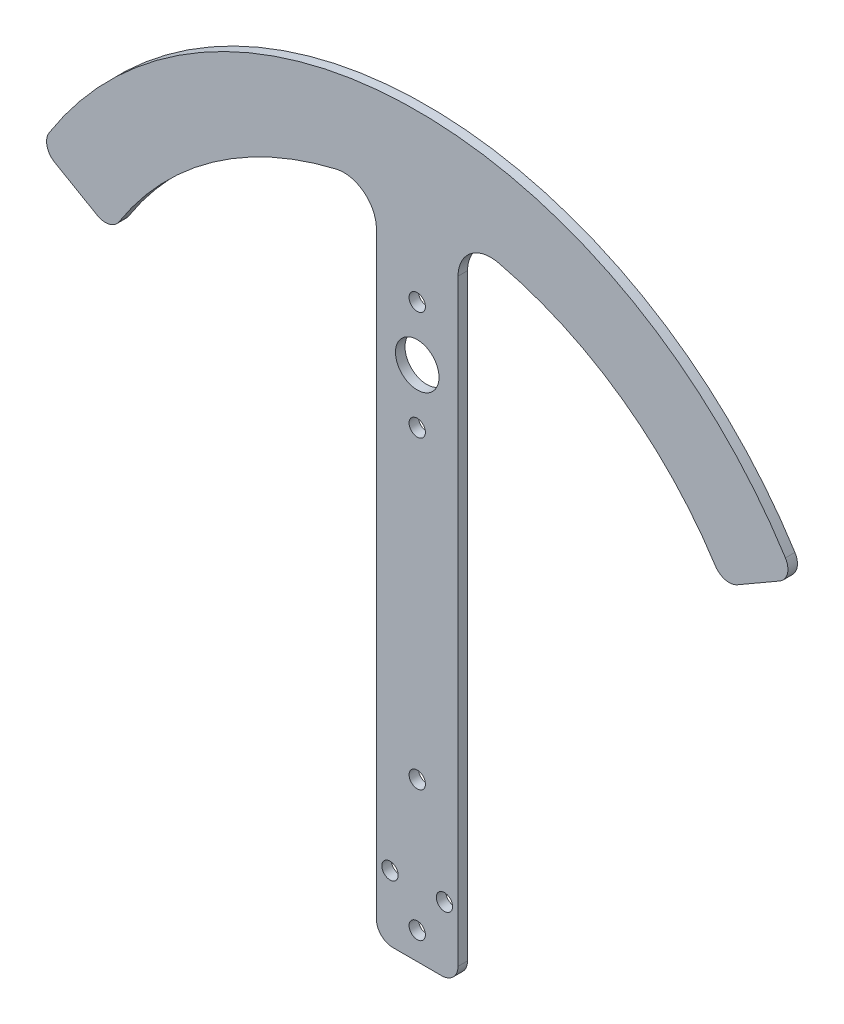
ISO-10303-21;
HEADER;
FILE_DESCRIPTION(('STEP AP214'),'2;1');
FILE_NAME('part.step','',(''),(''),'','','');
FILE_SCHEMA(('AUTOMOTIVE_DESIGN { 1 0 10303 214 1 1 1 1 }'));
ENDSEC;
DATA;
#1=APPLICATION_CONTEXT('core data for automotive mechanical design processes');
#2=APPLICATION_PROTOCOL_DEFINITION('international standard','automotive_design',2000,#1);
#3=PRODUCT_CONTEXT('',#1,'mechanical');
#4=PRODUCT('Part','Part','',(#3));
#5=PRODUCT_RELATED_PRODUCT_CATEGORY('part','',(#4));
#6=PRODUCT_DEFINITION_FORMATION('','',#4);
#7=PRODUCT_DEFINITION_CONTEXT('part definition',#1,'design');
#8=PRODUCT_DEFINITION('design','',#6,#7);
#9=PRODUCT_DEFINITION_SHAPE('','',#8);
#10=(LENGTH_UNIT() NAMED_UNIT(*) SI_UNIT(.MILLI.,.METRE.));
#11=(NAMED_UNIT(*) PLANE_ANGLE_UNIT() SI_UNIT($,.RADIAN.));
#12=(NAMED_UNIT(*) SI_UNIT($,.STERADIAN.) SOLID_ANGLE_UNIT());
#13=UNCERTAINTY_MEASURE_WITH_UNIT(LENGTH_MEASURE(1.E-05),#10,'distance_accuracy_value','');
#14=(GEOMETRIC_REPRESENTATION_CONTEXT(3) GLOBAL_UNCERTAINTY_ASSIGNED_CONTEXT((#13)) GLOBAL_UNIT_ASSIGNED_CONTEXT((#10,
#11,#12)) REPRESENTATION_CONTEXT('',''));
#15=CARTESIAN_POINT('',(0.,0.,0.));
#16=DIRECTION('',(0.,0.,1.));
#17=DIRECTION('',(1.,0.,0.));
#18=AXIS2_PLACEMENT_3D('',#15,#16,#17);
#19=CARTESIAN_POINT('',(0.,0.,1.75));
#20=DIRECTION('',(0.,0.,-1.));
#21=DIRECTION('',(-1.,0.,0.));
#22=AXIS2_PLACEMENT_3D('',#19,#20,#21);
#23=CYLINDRICAL_SURFACE('',#22,65.);
#24=CARTESIAN_POINT('',(0.,0.,1.75));
#25=DIRECTION('',(0.,0.,1.));
#26=DIRECTION('',(1.,0.,0.));
#27=AXIS2_PLACEMENT_3D('',#24,#25,#26);
#28=CIRCLE('',#27,65.);
#29=CARTESIAN_POINT('',(54.8030189340439,34.9518113366794,1.75));
#30=VERTEX_POINT('',#29);
#31=CARTESIAN_POINT('',(14.8728813559322,63.2755671659477,1.75));
#32=VERTEX_POINT('',#31);
#33=EDGE_CURVE('E258',#30,#32,#28,.T.);
#34=ORIENTED_EDGE('',*,*,#33,.T.);
#35=DIRECTION('',(0.,0.,-1.));
#36=VECTOR('',#35,1.);
#37=CARTESIAN_POINT('',(14.8728813559322,63.2755671659478,1.75));
#38=LINE('',#37,#36);
#39=CARTESIAN_POINT('',(14.8728813559322,63.2755671659477,0.));
#40=VERTEX_POINT('',#39);
#41=EDGE_CURVE('E240',#32,#40,#38,.T.);
#42=ORIENTED_EDGE('',*,*,#41,.T.);
#43=CARTESIAN_POINT('',(0.,0.,0.));
#44=DIRECTION('',(0.,0.,1.));
#45=DIRECTION('',(1.,0.,0.));
#46=AXIS2_PLACEMENT_3D('',#43,#44,#45);
#47=CIRCLE('',#46,65.);
#48=CARTESIAN_POINT('',(54.8030189340439,34.9518113366794,0.));
#49=VERTEX_POINT('',#48);
#50=EDGE_CURVE('E307',#49,#40,#47,.T.);
#51=ORIENTED_EDGE('',*,*,#50,.F.);
#52=DIRECTION('',(0.,0.,-1.));
#53=VECTOR('',#52,1.);
#54=CARTESIAN_POINT('',(54.8030189340439,34.9518113366794,1.75));
#55=LINE('',#54,#53);
#56=EDGE_CURVE('E230',#49,#30,#55,.F.);
#57=ORIENTED_EDGE('',*,*,#56,.T.);
#58=EDGE_LOOP('',(#34,#42,#51,#57));
#59=FACE_BOUND('',#58,.T.);
#60=ADVANCED_FACE('F44',(#59),#23,.F.);
#61=CARTESIAN_POINT('',(0.,0.,1.75));
#62=DIRECTION('',(-0.499999999999998,0.86602540378444,0.));
#63=DIRECTION('',(-0.86602540378444,-0.499999999999998,0.));
#64=AXIS2_PLACEMENT_3D('',#61,#62,#63);
#65=PLANE('',#64);
#66=DIRECTION('',(0.86602540378444,0.499999999999998,0.));
#67=VECTOR('',#66,1.);
#68=CARTESIAN_POINT('',(0.,0.,0.));
#69=LINE('',#68,#67);
#70=CARTESIAN_POINT('',(58.832389038692,33.9668956485574,0.));
#71=VERTEX_POINT('',#70);
#72=CARTESIAN_POINT('',(66.6333249958308,38.4707681233425,0.));
#73=VERTEX_POINT('',#72);
#74=EDGE_CURVE('E339',#71,#73,#69,.T.);
#75=ORIENTED_EDGE('',*,*,#74,.T.);
#76=DIRECTION('',(0.,0.,-1.));
#77=VECTOR('',#76,1.);
#78=CARTESIAN_POINT('',(66.6333249958308,38.4707681233425,1.75));
#79=LINE('',#78,#77);
#80=CARTESIAN_POINT('',(66.6333249958308,38.4707681233425,1.75));
#81=VERTEX_POINT('',#80);
#82=EDGE_CURVE('E228',#73,#81,#79,.F.);
#83=ORIENTED_EDGE('',*,*,#82,.T.);
#84=DIRECTION('',(0.86602540378444,0.499999999999998,0.));
#85=VECTOR('',#84,1.);
#86=CARTESIAN_POINT('',(0.,0.,1.75));
#87=LINE('',#86,#85);
#88=CARTESIAN_POINT('',(58.832389038692,33.9668956485574,1.75));
#89=VERTEX_POINT('',#88);
#90=EDGE_CURVE('E265',#89,#81,#87,.T.);
#91=ORIENTED_EDGE('',*,*,#90,.F.);
#92=DIRECTION('',(0.,0.,1.));
#93=VECTOR('',#92,1.);
#94=CARTESIAN_POINT('',(58.832389038692,33.9668956485574,0.));
#95=LINE('',#94,#93);
#96=EDGE_CURVE('E225',#89,#71,#95,.F.);
#97=ORIENTED_EDGE('',*,*,#96,.T.);
#98=EDGE_LOOP('',(#75,#83,#91,#97));
#99=FACE_BOUND('',#98,.T.);
#100=ADVANCED_FACE('F280',(#99),#65,.F.);
#101=CARTESIAN_POINT('',(0.,0.,1.75));
#102=DIRECTION('',(0.,0.,-1.));
#103=DIRECTION('',(-1.,0.,0.));
#104=AXIS2_PLACEMENT_3D('',#101,#102,#103);
#105=CYLINDRICAL_SURFACE('',#104,80.);
#106=CARTESIAN_POINT('',(0.,0.,1.75));
#107=DIRECTION('',(0.,0.,1.));
#108=DIRECTION('',(1.,0.,0.));
#109=AXIS2_PLACEMENT_3D('',#106,#107,#108);
#110=CIRCLE('',#109,80.);
#111=CARTESIAN_POINT('',(67.6709870086554,42.6689291789048,1.75));
#112=VERTEX_POINT('',#111);
#113=CARTESIAN_POINT('',(-67.6709870086554,42.6689291789048,1.75));
#114=VERTEX_POINT('',#113);
#115=EDGE_CURVE('E441',#112,#114,#110,.T.);
#116=ORIENTED_EDGE('',*,*,#115,.F.);
#117=DIRECTION('',(0.,0.,-1.));
#118=VECTOR('',#117,1.);
#119=CARTESIAN_POINT('',(67.6709870086554,42.6689291789048,1.75));
#120=LINE('',#119,#118);
#121=CARTESIAN_POINT('',(67.6709870086554,42.6689291789048,0.));
#122=VERTEX_POINT('',#121);
#123=EDGE_CURVE('E222',#112,#122,#120,.T.);
#124=ORIENTED_EDGE('',*,*,#123,.T.);
#125=CARTESIAN_POINT('',(0.,0.,0.));
#126=DIRECTION('',(0.,0.,1.));
#127=DIRECTION('',(1.,0.,0.));
#128=AXIS2_PLACEMENT_3D('',#125,#126,#127);
#129=CIRCLE('',#128,80.);
#130=CARTESIAN_POINT('',(-67.6709870086554,42.6689291789048,0.));
#131=VERTEX_POINT('',#130);
#132=EDGE_CURVE('E342',#122,#131,#129,.T.);
#133=ORIENTED_EDGE('',*,*,#132,.T.);
#134=DIRECTION('',(0.,0.,-1.));
#135=VECTOR('',#134,1.);
#136=CARTESIAN_POINT('',(-67.6709870086554,42.6689291789048,1.75));
#137=LINE('',#136,#135);
#138=EDGE_CURVE('E220',#131,#114,#137,.F.);
#139=ORIENTED_EDGE('',*,*,#138,.T.);
#140=EDGE_LOOP('',(#116,#124,#133,#139));
#141=FACE_BOUND('',#140,.T.);
#142=ADVANCED_FACE('F286',(#141),#105,.T.);
#143=CARTESIAN_POINT('',(0.,0.,1.75));
#144=DIRECTION('',(-0.499999999999998,-0.86602540378444,0.));
#145=DIRECTION('',(0.86602540378444,-0.499999999999998,0.));
#146=AXIS2_PLACEMENT_3D('',#143,#144,#145);
#147=PLANE('',#146);
#148=DIRECTION('',(-0.86602540378444,0.499999999999998,0.));
#149=VECTOR('',#148,1.);
#150=CARTESIAN_POINT('',(0.,0.,1.75));
#151=LINE('',#150,#149);
#152=CARTESIAN_POINT('',(-58.832389038692,33.9668956485574,1.75));
#153=VERTEX_POINT('',#152);
#154=CARTESIAN_POINT('',(-66.6333249958309,38.4707681233425,1.75));
#155=VERTEX_POINT('',#154);
#156=EDGE_CURVE('E317',#153,#155,#151,.T.);
#157=ORIENTED_EDGE('',*,*,#156,.T.);
#158=DIRECTION('',(0.,0.,1.));
#159=VECTOR('',#158,1.);
#160=CARTESIAN_POINT('',(-66.6333249958309,38.4707681233425,0.));
#161=LINE('',#160,#159);
#162=CARTESIAN_POINT('',(-66.6333249958309,38.4707681233425,0.));
#163=VERTEX_POINT('',#162);
#164=EDGE_CURVE('E234',#155,#163,#161,.F.);
#165=ORIENTED_EDGE('',*,*,#164,.T.);
#166=DIRECTION('',(-0.86602540378444,0.499999999999998,0.));
#167=VECTOR('',#166,1.);
#168=CARTESIAN_POINT('',(0.,0.,0.));
#169=LINE('',#168,#167);
#170=CARTESIAN_POINT('',(-58.832389038692,33.9668956485574,0.));
#171=VERTEX_POINT('',#170);
#172=EDGE_CURVE('E305',#171,#163,#169,.T.);
#173=ORIENTED_EDGE('',*,*,#172,.F.);
#174=DIRECTION('',(0.,0.,-1.));
#175=VECTOR('',#174,1.);
#176=CARTESIAN_POINT('',(-58.832389038692,33.9668956485574,1.75));
#177=LINE('',#176,#175);
#178=EDGE_CURVE('E232',#171,#153,#177,.F.);
#179=ORIENTED_EDGE('',*,*,#178,.T.);
#180=EDGE_LOOP('',(#157,#165,#173,#179));
#181=FACE_BOUND('',#180,.T.);
#182=ADVANCED_FACE('F293',(#181),#147,.T.);
#183=CARTESIAN_POINT('',(-14.8728813559322,63.2755671659477,0.));
#184=VERTEX_POINT('',#183);
#185=CARTESIAN_POINT('',(-54.8030189340439,34.9518113366794,0.));
#186=VERTEX_POINT('',#185);
#187=EDGE_CURVE('E301',#184,#186,#47,.T.);
#188=ORIENTED_EDGE('',*,*,#187,.F.);
#189=DIRECTION('',(0.,0.,-1.));
#190=VECTOR('',#189,1.);
#191=CARTESIAN_POINT('',(-14.8728813559322,63.2755671659478,1.75));
#192=LINE('',#191,#190);
#193=CARTESIAN_POINT('',(-14.8728813559322,63.2755671659477,1.75));
#194=VERTEX_POINT('',#193);
#195=EDGE_CURVE('E65',#184,#194,#192,.F.);
#196=ORIENTED_EDGE('',*,*,#195,.T.);
#197=CARTESIAN_POINT('',(-54.8030189340439,34.9518113366794,1.75));
#198=VERTEX_POINT('',#197);
#199=EDGE_CURVE('E267',#194,#198,#28,.T.);
#200=ORIENTED_EDGE('',*,*,#199,.T.);
#201=DIRECTION('',(0.,0.,-1.));
#202=VECTOR('',#201,1.);
#203=CARTESIAN_POINT('',(-54.8030189340439,34.9518113366794,1.75));
#204=LINE('',#203,#202);
#205=EDGE_CURVE('E237',#198,#186,#204,.T.);
#206=ORIENTED_EDGE('',*,*,#205,.T.);
#207=EDGE_LOOP('',(#188,#196,#200,#206));
#208=FACE_BOUND('',#207,.T.);
#209=ADVANCED_FACE('F282',(#208),#23,.F.);
#210=CARTESIAN_POINT('',(-7.50000000000001,0.,1.75));
#211=DIRECTION('',(1.,0.,0.));
#212=DIRECTION('',(0.,1.,0.));
#213=AXIS2_PLACEMENT_3D('',#210,#211,#212);
#214=PLANE('',#213);
#215=DIRECTION('',(0.,-1.,0.));
#216=VECTOR('',#215,1.);
#217=CARTESIAN_POINT('',(-7.50000000000001,0.,1.75));
#218=LINE('',#217,#216);
#219=CARTESIAN_POINT('',(-7.5,57.4347455813987,1.75));
#220=VERTEX_POINT('',#219);
#221=CARTESIAN_POINT('',(-7.50000000000001,-52.4341421492752,1.75));
#222=VERTEX_POINT('',#221);
#223=EDGE_CURVE('E311',#220,#222,#218,.T.);
#224=ORIENTED_EDGE('',*,*,#223,.F.);
#225=DIRECTION('',(0.,0.,-1.));
#226=VECTOR('',#225,1.);
#227=CARTESIAN_POINT('',(-7.5,57.4347455813987,1.75));
#228=LINE('',#227,#226);
#229=CARTESIAN_POINT('',(-7.5,57.4347455813987,0.));
#230=VERTEX_POINT('',#229);
#231=EDGE_CURVE('E245',#220,#230,#228,.T.);
#232=ORIENTED_EDGE('',*,*,#231,.T.);
#233=DIRECTION('',(0.,-1.,0.));
#234=VECTOR('',#233,1.);
#235=CARTESIAN_POINT('',(-7.50000000000001,0.,0.));
#236=LINE('',#235,#234);
#237=CARTESIAN_POINT('',(-7.50000000000001,-52.4341421492752,0.));
#238=VERTEX_POINT('',#237);
#239=EDGE_CURVE('E304',#230,#238,#236,.T.);
#240=ORIENTED_EDGE('',*,*,#239,.T.);
#241=DIRECTION('',(0.,0.,-1.));
#242=VECTOR('',#241,1.);
#243=CARTESIAN_POINT('',(-7.50000000000001,-52.4341421492752,1.75));
#244=LINE('',#243,#242);
#245=EDGE_CURVE('E217',#238,#222,#244,.F.);
#246=ORIENTED_EDGE('',*,*,#245,.T.);
#247=EDGE_LOOP('',(#224,#232,#240,#246));
#248=FACE_BOUND('',#247,.T.);
#249=ADVANCED_FACE('F292',(#248),#214,.F.);
#250=CARTESIAN_POINT('',(0.,-55.4341421492752,1.75));
#251=DIRECTION('',(0.,1.,0.));
#252=DIRECTION('',(0.,0.,1.));
#253=AXIS2_PLACEMENT_3D('',#250,#251,#252);
#254=PLANE('',#253);
#255=DIRECTION('',(1.,0.,0.));
#256=VECTOR('',#255,1.);
#257=CARTESIAN_POINT('',(0.,-55.4341421492752,0.));
#258=LINE('',#257,#256);
#259=CARTESIAN_POINT('',(-4.50000000000001,-55.4341421492752,0.));
#260=VERTEX_POINT('',#259);
#261=CARTESIAN_POINT('',(4.50000000000001,-55.4341421492752,0.));
#262=VERTEX_POINT('',#261);
#263=EDGE_CURVE('E166',#260,#262,#258,.T.);
#264=ORIENTED_EDGE('',*,*,#263,.T.);
#265=DIRECTION('',(0.,0.,-1.));
#266=VECTOR('',#265,1.);
#267=CARTESIAN_POINT('',(4.50000000000001,-55.4341421492752,1.75));
#268=LINE('',#267,#266);
#269=CARTESIAN_POINT('',(4.50000000000001,-55.4341421492752,1.75));
#270=VERTEX_POINT('',#269);
#271=EDGE_CURVE('E174',#262,#270,#268,.F.);
#272=ORIENTED_EDGE('',*,*,#271,.T.);
#273=DIRECTION('',(1.,0.,0.));
#274=VECTOR('',#273,1.);
#275=CARTESIAN_POINT('',(0.,-55.4341421492752,1.75));
#276=LINE('',#275,#274);
#277=CARTESIAN_POINT('',(-4.50000000000001,-55.4341421492752,1.75));
#278=VERTEX_POINT('',#277);
#279=EDGE_CURVE('E314',#278,#270,#276,.T.);
#280=ORIENTED_EDGE('',*,*,#279,.F.);
#281=DIRECTION('',(0.,0.,-1.));
#282=VECTOR('',#281,1.);
#283=CARTESIAN_POINT('',(-4.50000000000001,-55.4341421492752,1.75));
#284=LINE('',#283,#282);
#285=EDGE_CURVE('E175',#278,#260,#284,.T.);
#286=ORIENTED_EDGE('',*,*,#285,.T.);
#287=EDGE_LOOP('',(#264,#272,#280,#286));
#288=FACE_BOUND('',#287,.T.);
#289=ADVANCED_FACE('F298',(#288),#254,.F.);
#290=CARTESIAN_POINT('',(-5.,-43.4341421492752,1.75));
#291=DIRECTION('',(0.,0.,-1.));
#292=DIRECTION('',(-1.,0.,0.));
#293=AXIS2_PLACEMENT_3D('',#290,#291,#292);
#294=CYLINDRICAL_SURFACE('',#293,1.5);
#295=CARTESIAN_POINT('',(-5.,-43.4341421492752,1.75));
#296=DIRECTION('',(0.,0.,1.));
#297=DIRECTION('',(1.,0.,0.));
#298=AXIS2_PLACEMENT_3D('',#295,#296,#297);
#299=CIRCLE('',#298,1.5);
#300=CARTESIAN_POINT('',(-3.5,-43.4341421492752,1.75));
#301=VERTEX_POINT('',#300);
#302=EDGE_CURVE('E188',#301,#301,#299,.T.);
#303=ORIENTED_EDGE('',*,*,#302,.T.);
#304=EDGE_LOOP('',(#303));
#305=FACE_BOUND('',#304,.T.);
#306=CARTESIAN_POINT('',(-5.,-43.4341421492752,0.));
#307=DIRECTION('',(0.,0.,1.));
#308=DIRECTION('',(1.,0.,0.));
#309=AXIS2_PLACEMENT_3D('',#306,#307,#308);
#310=CIRCLE('',#309,1.5);
#311=CARTESIAN_POINT('',(-3.5,-43.4341421492752,0.));
#312=VERTEX_POINT('',#311);
#313=EDGE_CURVE('E362',#312,#312,#310,.T.);
#314=ORIENTED_EDGE('',*,*,#313,.F.);
#315=EDGE_LOOP('',(#314));
#316=FACE_BOUND('',#315,.T.);
#317=ADVANCED_FACE('F383',(#305,#316),#294,.F.);
#318=CARTESIAN_POINT('',(5.,-43.4341421492752,1.75));
#319=DIRECTION('',(0.,0.,-1.));
#320=DIRECTION('',(-1.,0.,0.));
#321=AXIS2_PLACEMENT_3D('',#318,#319,#320);
#322=CYLINDRICAL_SURFACE('',#321,1.5);
#323=CARTESIAN_POINT('',(5.,-43.4341421492752,1.75));
#324=DIRECTION('',(0.,0.,1.));
#325=DIRECTION('',(1.,0.,0.));
#326=AXIS2_PLACEMENT_3D('',#323,#324,#325);
#327=CIRCLE('',#326,1.5);
#328=CARTESIAN_POINT('',(6.5,-43.4341421492752,1.75));
#329=VERTEX_POINT('',#328);
#330=EDGE_CURVE('E334',#329,#329,#327,.T.);
#331=ORIENTED_EDGE('',*,*,#330,.T.);
#332=EDGE_LOOP('',(#331));
#333=FACE_BOUND('',#332,.T.);
#334=CARTESIAN_POINT('',(5.,-43.4341421492752,0.));
#335=DIRECTION('',(0.,0.,1.));
#336=DIRECTION('',(1.,0.,0.));
#337=AXIS2_PLACEMENT_3D('',#334,#335,#336);
#338=CIRCLE('',#337,1.5);
#339=CARTESIAN_POINT('',(6.5,-43.4341421492752,0.));
#340=VERTEX_POINT('',#339);
#341=EDGE_CURVE('E360',#340,#340,#338,.T.);
#342=ORIENTED_EDGE('',*,*,#341,.F.);
#343=EDGE_LOOP('',(#342));
#344=FACE_BOUND('',#343,.T.);
#345=ADVANCED_FACE('F386',(#333,#344),#322,.F.);
#346=CARTESIAN_POINT('',(0.,-26.4341421492752,1.75));
#347=DIRECTION('',(0.,0.,-1.));
#348=DIRECTION('',(-1.,0.,0.));
#349=AXIS2_PLACEMENT_3D('',#346,#347,#348);
#350=CYLINDRICAL_SURFACE('',#349,1.5);
#351=CARTESIAN_POINT('',(0.,-26.4341421492752,1.75));
#352=DIRECTION('',(0.,0.,1.));
#353=DIRECTION('',(1.,0.,0.));
#354=AXIS2_PLACEMENT_3D('',#351,#352,#353);
#355=CIRCLE('',#354,1.5);
#356=CARTESIAN_POINT('',(1.5,-26.4341421492752,1.75));
#357=VERTEX_POINT('',#356);
#358=EDGE_CURVE('E331',#357,#357,#355,.T.);
#359=ORIENTED_EDGE('',*,*,#358,.T.);
#360=EDGE_LOOP('',(#359));
#361=FACE_BOUND('',#360,.T.);
#362=CARTESIAN_POINT('',(0.,-26.4341421492752,0.));
#363=DIRECTION('',(0.,0.,1.));
#364=DIRECTION('',(1.,0.,0.));
#365=AXIS2_PLACEMENT_3D('',#362,#363,#364);
#366=CIRCLE('',#365,1.5);
#367=CARTESIAN_POINT('',(1.5,-26.4341421492752,0.));
#368=VERTEX_POINT('',#367);
#369=EDGE_CURVE('E357',#368,#368,#366,.T.);
#370=ORIENTED_EDGE('',*,*,#369,.F.);
#371=EDGE_LOOP('',(#370));
#372=FACE_BOUND('',#371,.T.);
#373=ADVANCED_FACE('F390',(#361,#372),#350,.F.);
#374=CARTESIAN_POINT('',(0.,39.5658578507248,1.75));
#375=DIRECTION('',(0.,0.,-1.));
#376=DIRECTION('',(-1.,0.,0.));
#377=AXIS2_PLACEMENT_3D('',#374,#375,#376);
#378=CYLINDRICAL_SURFACE('',#377,4.00000000000001);
#379=CARTESIAN_POINT('',(0.,39.5658578507248,1.75));
#380=DIRECTION('',(0.,0.,1.));
#381=DIRECTION('',(1.,0.,0.));
#382=AXIS2_PLACEMENT_3D('',#379,#380,#381);
#383=CIRCLE('',#382,4.00000000000001);
#384=CARTESIAN_POINT('',(4.00000000000001,39.5658578507248,1.75));
#385=VERTEX_POINT('',#384);
#386=EDGE_CURVE('E328',#385,#385,#383,.T.);
#387=ORIENTED_EDGE('',*,*,#386,.T.);
#388=EDGE_LOOP('',(#387));
#389=FACE_BOUND('',#388,.T.);
#390=CARTESIAN_POINT('',(0.,39.5658578507248,0.));
#391=DIRECTION('',(0.,0.,1.));
#392=DIRECTION('',(1.,0.,0.));
#393=AXIS2_PLACEMENT_3D('',#390,#391,#392);
#394=CIRCLE('',#393,4.00000000000001);
#395=CARTESIAN_POINT('',(4.00000000000001,39.5658578507248,0.));
#396=VERTEX_POINT('',#395);
#397=EDGE_CURVE('E354',#396,#396,#394,.T.);
#398=ORIENTED_EDGE('',*,*,#397,.F.);
#399=EDGE_LOOP('',(#398));
#400=FACE_BOUND('',#399,.T.);
#401=ADVANCED_FACE('F394',(#389,#400),#378,.F.);
#402=CARTESIAN_POINT('',(0.,29.5658578507248,1.75));
#403=DIRECTION('',(0.,0.,-1.));
#404=DIRECTION('',(-1.,0.,0.));
#405=AXIS2_PLACEMENT_3D('',#402,#403,#404);
#406=CYLINDRICAL_SURFACE('',#405,1.5);
#407=CARTESIAN_POINT('',(0.,29.5658578507248,1.75));
#408=DIRECTION('',(0.,0.,1.));
#409=DIRECTION('',(1.,0.,0.));
#410=AXIS2_PLACEMENT_3D('',#407,#408,#409);
#411=CIRCLE('',#410,1.5);
#412=CARTESIAN_POINT('',(1.5,29.5658578507248,1.75));
#413=VERTEX_POINT('',#412);
#414=EDGE_CURVE('E325',#413,#413,#411,.T.);
#415=ORIENTED_EDGE('',*,*,#414,.T.);
#416=EDGE_LOOP('',(#415));
#417=FACE_BOUND('',#416,.T.);
#418=CARTESIAN_POINT('',(0.,29.5658578507248,0.));
#419=DIRECTION('',(0.,0.,1.));
#420=DIRECTION('',(1.,0.,0.));
#421=AXIS2_PLACEMENT_3D('',#418,#419,#420);
#422=CIRCLE('',#421,1.5);
#423=CARTESIAN_POINT('',(1.5,29.5658578507248,0.));
#424=VERTEX_POINT('',#423);
#425=EDGE_CURVE('E351',#424,#424,#422,.T.);
#426=ORIENTED_EDGE('',*,*,#425,.F.);
#427=EDGE_LOOP('',(#426));
#428=FACE_BOUND('',#427,.T.);
#429=ADVANCED_FACE('F398',(#417,#428),#406,.F.);
#430=CARTESIAN_POINT('',(0.,49.5658578507248,1.75));
#431=DIRECTION('',(0.,0.,-1.));
#432=DIRECTION('',(-1.,0.,0.));
#433=AXIS2_PLACEMENT_3D('',#430,#431,#432);
#434=CYLINDRICAL_SURFACE('',#433,1.5);
#435=CARTESIAN_POINT('',(0.,49.5658578507248,1.75));
#436=DIRECTION('',(0.,0.,1.));
#437=DIRECTION('',(1.,0.,0.));
#438=AXIS2_PLACEMENT_3D('',#435,#436,#437);
#439=CIRCLE('',#438,1.5);
#440=CARTESIAN_POINT('',(1.5,49.5658578507248,1.75));
#441=VERTEX_POINT('',#440);
#442=EDGE_CURVE('E322',#441,#441,#439,.T.);
#443=ORIENTED_EDGE('',*,*,#442,.T.);
#444=EDGE_LOOP('',(#443));
#445=FACE_BOUND('',#444,.T.);
#446=CARTESIAN_POINT('',(0.,49.5658578507248,0.));
#447=DIRECTION('',(0.,0.,1.));
#448=DIRECTION('',(1.,0.,0.));
#449=AXIS2_PLACEMENT_3D('',#446,#447,#448);
#450=CIRCLE('',#449,1.5);
#451=CARTESIAN_POINT('',(1.5,49.5658578507248,0.));
#452=VERTEX_POINT('',#451);
#453=EDGE_CURVE('E165',#452,#452,#450,.T.);
#454=ORIENTED_EDGE('',*,*,#453,.F.);
#455=EDGE_LOOP('',(#454));
#456=FACE_BOUND('',#455,.T.);
#457=ADVANCED_FACE('F379',(#445,#456),#434,.F.);
#458=CARTESIAN_POINT('',(7.50000000000001,0.,1.75));
#459=DIRECTION('',(1.,0.,0.));
#460=DIRECTION('',(0.,1.,0.));
#461=AXIS2_PLACEMENT_3D('',#458,#459,#460);
#462=PLANE('',#461);
#463=DIRECTION('',(0.,-1.,0.));
#464=VECTOR('',#463,1.);
#465=CARTESIAN_POINT('',(7.50000000000001,0.,0.));
#466=LINE('',#465,#464);
#467=CARTESIAN_POINT('',(7.5,57.4347455813987,0.));
#468=VERTEX_POINT('',#467);
#469=CARTESIAN_POINT('',(7.50000000000001,-52.4341421492752,0.));
#470=VERTEX_POINT('',#469);
#471=EDGE_CURVE('E153',#468,#470,#466,.T.);
#472=ORIENTED_EDGE('',*,*,#471,.F.);
#473=DIRECTION('',(0.,0.,1.));
#474=VECTOR('',#473,1.);
#475=CARTESIAN_POINT('',(7.5,57.4347455813987,1.75));
#476=LINE('',#475,#474);
#477=CARTESIAN_POINT('',(7.5,57.4347455813987,1.75));
#478=VERTEX_POINT('',#477);
#479=EDGE_CURVE('E243',#468,#478,#476,.T.);
#480=ORIENTED_EDGE('',*,*,#479,.T.);
#481=DIRECTION('',(0.,-1.,0.));
#482=VECTOR('',#481,1.);
#483=CARTESIAN_POINT('',(7.50000000000001,0.,1.75));
#484=LINE('',#483,#482);
#485=CARTESIAN_POINT('',(7.50000000000001,-52.4341421492752,1.75));
#486=VERTEX_POINT('',#485);
#487=EDGE_CURVE('E180',#478,#486,#484,.T.);
#488=ORIENTED_EDGE('',*,*,#487,.T.);
#489=DIRECTION('',(0.,0.,-1.));
#490=VECTOR('',#489,1.);
#491=CARTESIAN_POINT('',(7.50000000000001,-52.4341421492752,0.));
#492=LINE('',#491,#490);
#493=EDGE_CURVE('E173',#486,#470,#492,.T.);
#494=ORIENTED_EDGE('',*,*,#493,.T.);
#495=EDGE_LOOP('',(#472,#480,#488,#494));
#496=FACE_BOUND('',#495,.T.);
#497=ADVANCED_FACE('F178',(#496),#462,.T.);
#498=CARTESIAN_POINT('',(0.,-50.4341421492752,1.75));
#499=DIRECTION('',(0.,0.,-1.));
#500=DIRECTION('',(-1.,0.,0.));
#501=AXIS2_PLACEMENT_3D('',#498,#499,#500);
#502=CYLINDRICAL_SURFACE('',#501,1.5);
#503=CARTESIAN_POINT('',(0.,-50.4341421492752,1.75));
#504=DIRECTION('',(0.,0.,1.));
#505=DIRECTION('',(1.,0.,0.));
#506=AXIS2_PLACEMENT_3D('',#503,#504,#505);
#507=CIRCLE('',#506,1.5);
#508=CARTESIAN_POINT('',(1.5,-50.4341421492752,1.75));
#509=VERTEX_POINT('',#508);
#510=EDGE_CURVE('E183',#509,#509,#507,.T.);
#511=ORIENTED_EDGE('',*,*,#510,.T.);
#512=EDGE_LOOP('',(#511));
#513=FACE_BOUND('',#512,.T.);
#514=CARTESIAN_POINT('',(0.,-50.4341421492752,0.));
#515=DIRECTION('',(0.,0.,1.));
#516=DIRECTION('',(1.,0.,0.));
#517=AXIS2_PLACEMENT_3D('',#514,#515,#516);
#518=CIRCLE('',#517,1.5);
#519=CARTESIAN_POINT('',(1.5,-50.4341421492752,0.));
#520=VERTEX_POINT('',#519);
#521=EDGE_CURVE('E191',#520,#520,#518,.T.);
#522=ORIENTED_EDGE('',*,*,#521,.F.);
#523=EDGE_LOOP('',(#522));
#524=FACE_BOUND('',#523,.T.);
#525=ADVANCED_FACE('F370',(#513,#524),#502,.F.);
#526=CARTESIAN_POINT('',(0.,0.,1.75));
#527=DIRECTION('',(0.,0.,1.));
#528=DIRECTION('',(1.,0.,0.));
#529=AXIS2_PLACEMENT_3D('',#526,#527,#528);
#530=PLANE('',#529);
#531=ORIENTED_EDGE('',*,*,#279,.T.);
#532=CARTESIAN_POINT('',(4.50000000000001,-52.4341421492752,1.75));
#533=DIRECTION('',(0.,0.,1.));
#534=DIRECTION('',(1.,0.,0.));
#535=AXIS2_PLACEMENT_3D('',#532,#533,#534);
#536=CIRCLE('',#535,3.);
#537=EDGE_CURVE('E215',#270,#486,#536,.T.);
#538=ORIENTED_EDGE('',*,*,#537,.T.);
#539=ORIENTED_EDGE('',*,*,#487,.F.);
#540=CARTESIAN_POINT('',(13.5,57.4347455813987,1.75));
#541=DIRECTION('',(0.,0.,1.));
#542=DIRECTION('',(1.,0.,0.));
#543=AXIS2_PLACEMENT_3D('',#540,#541,#542);
#544=CIRCLE('',#543,6.);
#545=EDGE_CURVE('E250',#478,#32,#544,.F.);
#546=ORIENTED_EDGE('',*,*,#545,.T.);
#547=ORIENTED_EDGE('',*,*,#33,.F.);
#548=CARTESIAN_POINT('',(57.3323890386921,36.5649718599107,1.75));
#549=DIRECTION('',(0.,0.,1.));
#550=DIRECTION('',(1.,0.,0.));
#551=AXIS2_PLACEMENT_3D('',#548,#549,#550);
#552=CIRCLE('',#551,3.);
#553=EDGE_CURVE('E209',#30,#89,#552,.T.);
#554=ORIENTED_EDGE('',*,*,#553,.T.);
#555=ORIENTED_EDGE('',*,*,#90,.T.);
#556=CARTESIAN_POINT('',(65.1333249958309,41.0688443346958,1.75));
#557=DIRECTION('',(0.,0.,1.));
#558=DIRECTION('',(1.,0.,0.));
#559=AXIS2_PLACEMENT_3D('',#556,#557,#558);
#560=CIRCLE('',#559,3.);
#561=EDGE_CURVE('E211',#81,#112,#560,.T.);
#562=ORIENTED_EDGE('',*,*,#561,.T.);
#563=ORIENTED_EDGE('',*,*,#115,.T.);
#564=CARTESIAN_POINT('',(-65.1333249958309,41.0688443346958,1.75));
#565=DIRECTION('',(0.,0.,1.));
#566=DIRECTION('',(1.,0.,0.));
#567=AXIS2_PLACEMENT_3D('',#564,#565,#566);
#568=CIRCLE('',#567,3.);
#569=EDGE_CURVE('E207',#114,#155,#568,.T.);
#570=ORIENTED_EDGE('',*,*,#569,.T.);
#571=ORIENTED_EDGE('',*,*,#156,.F.);
#572=CARTESIAN_POINT('',(-57.332389038692,36.5649718599107,1.75));
#573=DIRECTION('',(0.,0.,1.));
#574=DIRECTION('',(1.,0.,0.));
#575=AXIS2_PLACEMENT_3D('',#572,#573,#574);
#576=CIRCLE('',#575,3.);
#577=EDGE_CURVE('E204',#153,#198,#576,.T.);
#578=ORIENTED_EDGE('',*,*,#577,.T.);
#579=ORIENTED_EDGE('',*,*,#199,.F.);
#580=CARTESIAN_POINT('',(-13.5,57.4347455813987,1.75));
#581=DIRECTION('',(0.,0.,1.));
#582=DIRECTION('',(1.,0.,0.));
#583=AXIS2_PLACEMENT_3D('',#580,#581,#582);
#584=CIRCLE('',#583,6.);
#585=EDGE_CURVE('E11',#194,#220,#584,.F.);
#586=ORIENTED_EDGE('',*,*,#585,.T.);
#587=ORIENTED_EDGE('',*,*,#223,.T.);
#588=CARTESIAN_POINT('',(-4.50000000000001,-52.4341421492752,1.75));
#589=DIRECTION('',(0.,0.,1.));
#590=DIRECTION('',(1.,0.,0.));
#591=AXIS2_PLACEMENT_3D('',#588,#589,#590);
#592=CIRCLE('',#591,3.);
#593=EDGE_CURVE('E213',#222,#278,#592,.T.);
#594=ORIENTED_EDGE('',*,*,#593,.T.);
#595=EDGE_LOOP('',(#531,#538,#539,#546,#547,#554,#555,#562,#563,#570,#571,#578,#579,#586,#587,#594));
#596=FACE_BOUND('',#595,.T.);
#597=ORIENTED_EDGE('',*,*,#442,.F.);
#598=EDGE_LOOP('',(#597));
#599=FACE_BOUND('',#598,.T.);
#600=ORIENTED_EDGE('',*,*,#414,.F.);
#601=EDGE_LOOP('',(#600));
#602=FACE_BOUND('',#601,.T.);
#603=ORIENTED_EDGE('',*,*,#386,.F.);
#604=EDGE_LOOP('',(#603));
#605=FACE_BOUND('',#604,.T.);
#606=ORIENTED_EDGE('',*,*,#358,.F.);
#607=EDGE_LOOP('',(#606));
#608=FACE_BOUND('',#607,.T.);
#609=ORIENTED_EDGE('',*,*,#330,.F.);
#610=EDGE_LOOP('',(#609));
#611=FACE_BOUND('',#610,.T.);
#612=ORIENTED_EDGE('',*,*,#302,.F.);
#613=EDGE_LOOP('',(#612));
#614=FACE_BOUND('',#613,.T.);
#615=ORIENTED_EDGE('',*,*,#510,.F.);
#616=EDGE_LOOP('',(#615));
#617=FACE_BOUND('',#616,.T.);
#618=ADVANCED_FACE('F256',(#596,#599,#602,#605,#608,#611,#614,#617),#530,.T.);
#619=CARTESIAN_POINT('',(0.,0.,0.));
#620=DIRECTION('',(0.,0.,1.));
#621=DIRECTION('',(1.,0.,0.));
#622=AXIS2_PLACEMENT_3D('',#619,#620,#621);
#623=PLANE('',#622);
#624=ORIENTED_EDGE('',*,*,#50,.T.);
#625=CARTESIAN_POINT('',(13.5,57.4347455813987,0.));
#626=DIRECTION('',(0.,0.,1.));
#627=DIRECTION('',(1.,0.,0.));
#628=AXIS2_PLACEMENT_3D('',#625,#626,#627);
#629=CIRCLE('',#628,6.);
#630=EDGE_CURVE('E161',#40,#468,#629,.T.);
#631=ORIENTED_EDGE('',*,*,#630,.T.);
#632=ORIENTED_EDGE('',*,*,#471,.T.);
#633=CARTESIAN_POINT('',(4.50000000000001,-52.4341421492752,0.));
#634=DIRECTION('',(0.,0.,1.));
#635=DIRECTION('',(1.,0.,0.));
#636=AXIS2_PLACEMENT_3D('',#633,#634,#635);
#637=CIRCLE('',#636,3.);
#638=EDGE_CURVE('E159',#470,#262,#637,.F.);
#639=ORIENTED_EDGE('',*,*,#638,.T.);
#640=ORIENTED_EDGE('',*,*,#263,.F.);
#641=CARTESIAN_POINT('',(-4.50000000000001,-52.4341421492752,0.));
#642=DIRECTION('',(0.,0.,1.));
#643=DIRECTION('',(1.,0.,0.));
#644=AXIS2_PLACEMENT_3D('',#641,#642,#643);
#645=CIRCLE('',#644,3.);
#646=EDGE_CURVE('E176',#260,#238,#645,.F.);
#647=ORIENTED_EDGE('',*,*,#646,.T.);
#648=ORIENTED_EDGE('',*,*,#239,.F.);
#649=CARTESIAN_POINT('',(-13.5,57.4347455813987,0.));
#650=DIRECTION('',(0.,0.,1.));
#651=DIRECTION('',(1.,0.,0.));
#652=AXIS2_PLACEMENT_3D('',#649,#650,#651);
#653=CIRCLE('',#652,6.);
#654=EDGE_CURVE('E52',#230,#184,#653,.T.);
#655=ORIENTED_EDGE('',*,*,#654,.T.);
#656=ORIENTED_EDGE('',*,*,#187,.T.);
#657=CARTESIAN_POINT('',(-57.332389038692,36.5649718599107,0.));
#658=DIRECTION('',(0.,0.,1.));
#659=DIRECTION('',(1.,0.,0.));
#660=AXIS2_PLACEMENT_3D('',#657,#658,#659);
#661=CIRCLE('',#660,3.);
#662=EDGE_CURVE('E182',#186,#171,#661,.F.);
#663=ORIENTED_EDGE('',*,*,#662,.T.);
#664=ORIENTED_EDGE('',*,*,#172,.T.);
#665=CARTESIAN_POINT('',(-65.1333249958309,41.0688443346958,0.));
#666=DIRECTION('',(0.,0.,1.));
#667=DIRECTION('',(1.,0.,0.));
#668=AXIS2_PLACEMENT_3D('',#665,#666,#667);
#669=CIRCLE('',#668,3.);
#670=EDGE_CURVE('E185',#163,#131,#669,.F.);
#671=ORIENTED_EDGE('',*,*,#670,.T.);
#672=ORIENTED_EDGE('',*,*,#132,.F.);
#673=CARTESIAN_POINT('',(65.1333249958309,41.0688443346958,0.));
#674=DIRECTION('',(0.,0.,1.));
#675=DIRECTION('',(1.,0.,0.));
#676=AXIS2_PLACEMENT_3D('',#673,#674,#675);
#677=CIRCLE('',#676,3.);
#678=EDGE_CURVE('E197',#122,#73,#677,.F.);
#679=ORIENTED_EDGE('',*,*,#678,.T.);
#680=ORIENTED_EDGE('',*,*,#74,.F.);
#681=CARTESIAN_POINT('',(57.3323890386921,36.5649718599107,0.));
#682=DIRECTION('',(0.,0.,1.));
#683=DIRECTION('',(1.,0.,0.));
#684=AXIS2_PLACEMENT_3D('',#681,#682,#683);
#685=CIRCLE('',#684,3.);
#686=EDGE_CURVE('E195',#71,#49,#685,.F.);
#687=ORIENTED_EDGE('',*,*,#686,.T.);
#688=EDGE_LOOP('',(#624,#631,#632,#639,#640,#647,#648,#655,#656,#663,#664,#671,#672,#679,#680,#687));
#689=FACE_BOUND('',#688,.T.);
#690=ORIENTED_EDGE('',*,*,#453,.T.);
#691=EDGE_LOOP('',(#690));
#692=FACE_BOUND('',#691,.T.);
#693=ORIENTED_EDGE('',*,*,#425,.T.);
#694=EDGE_LOOP('',(#693));
#695=FACE_BOUND('',#694,.T.);
#696=ORIENTED_EDGE('',*,*,#397,.T.);
#697=EDGE_LOOP('',(#696));
#698=FACE_BOUND('',#697,.T.);
#699=ORIENTED_EDGE('',*,*,#369,.T.);
#700=EDGE_LOOP('',(#699));
#701=FACE_BOUND('',#700,.T.);
#702=ORIENTED_EDGE('',*,*,#341,.T.);
#703=EDGE_LOOP('',(#702));
#704=FACE_BOUND('',#703,.T.);
#705=ORIENTED_EDGE('',*,*,#313,.T.);
#706=EDGE_LOOP('',(#705));
#707=FACE_BOUND('',#706,.T.);
#708=ORIENTED_EDGE('',*,*,#521,.T.);
#709=EDGE_LOOP('',(#708));
#710=FACE_BOUND('',#709,.T.);
#711=ADVANCED_FACE('F156',(#689,#692,#695,#698,#701,#704,#707,#710),#623,.F.);
#712=CARTESIAN_POINT('',(4.50000000000001,-52.4341421492752,1.75));
#713=DIRECTION('',(0.,0.,1.));
#714=DIRECTION('',(1.,0.,0.));
#715=AXIS2_PLACEMENT_3D('',#712,#713,#714);
#716=CYLINDRICAL_SURFACE('',#715,3.);
#717=ORIENTED_EDGE('',*,*,#537,.F.);
#718=ORIENTED_EDGE('',*,*,#271,.F.);
#719=ORIENTED_EDGE('',*,*,#638,.F.);
#720=ORIENTED_EDGE('',*,*,#493,.F.);
#721=EDGE_LOOP('',(#717,#718,#719,#720));
#722=FACE_BOUND('',#721,.T.);
#723=ADVANCED_FACE('F172',(#722),#716,.T.);
#724=CARTESIAN_POINT('',(-4.50000000000001,-52.4341421492752,1.75));
#725=DIRECTION('',(0.,0.,-1.));
#726=DIRECTION('',(-1.,0.,0.));
#727=AXIS2_PLACEMENT_3D('',#724,#725,#726);
#728=CYLINDRICAL_SURFACE('',#727,3.);
#729=ORIENTED_EDGE('',*,*,#593,.F.);
#730=ORIENTED_EDGE('',*,*,#245,.F.);
#731=ORIENTED_EDGE('',*,*,#646,.F.);
#732=ORIENTED_EDGE('',*,*,#285,.F.);
#733=EDGE_LOOP('',(#729,#730,#731,#732));
#734=FACE_BOUND('',#733,.T.);
#735=ADVANCED_FACE('F413',(#734),#728,.T.);
#736=CARTESIAN_POINT('',(65.1333249958309,41.0688443346958,1.75));
#737=DIRECTION('',(0.,0.,-1.));
#738=DIRECTION('',(-1.,0.,0.));
#739=AXIS2_PLACEMENT_3D('',#736,#737,#738);
#740=CYLINDRICAL_SURFACE('',#739,3.);
#741=ORIENTED_EDGE('',*,*,#561,.F.);
#742=ORIENTED_EDGE('',*,*,#82,.F.);
#743=ORIENTED_EDGE('',*,*,#678,.F.);
#744=ORIENTED_EDGE('',*,*,#123,.F.);
#745=EDGE_LOOP('',(#741,#742,#743,#744));
#746=FACE_BOUND('',#745,.T.);
#747=ADVANCED_FACE('F415',(#746),#740,.T.);
#748=CARTESIAN_POINT('',(57.3323890386921,36.5649718599107,1.75));
#749=DIRECTION('',(0.,0.,-1.));
#750=DIRECTION('',(-1.,0.,0.));
#751=AXIS2_PLACEMENT_3D('',#748,#749,#750);
#752=CYLINDRICAL_SURFACE('',#751,3.);
#753=ORIENTED_EDGE('',*,*,#553,.F.);
#754=ORIENTED_EDGE('',*,*,#56,.F.);
#755=ORIENTED_EDGE('',*,*,#686,.F.);
#756=ORIENTED_EDGE('',*,*,#96,.F.);
#757=EDGE_LOOP('',(#753,#754,#755,#756));
#758=FACE_BOUND('',#757,.T.);
#759=ADVANCED_FACE('F421',(#758),#752,.T.);
#760=CARTESIAN_POINT('',(-65.1333249958309,41.0688443346958,1.75));
#761=DIRECTION('',(0.,0.,-1.));
#762=DIRECTION('',(-1.,0.,0.));
#763=AXIS2_PLACEMENT_3D('',#760,#761,#762);
#764=CYLINDRICAL_SURFACE('',#763,3.);
#765=ORIENTED_EDGE('',*,*,#569,.F.);
#766=ORIENTED_EDGE('',*,*,#138,.F.);
#767=ORIENTED_EDGE('',*,*,#670,.F.);
#768=ORIENTED_EDGE('',*,*,#164,.F.);
#769=EDGE_LOOP('',(#765,#766,#767,#768));
#770=FACE_BOUND('',#769,.T.);
#771=ADVANCED_FACE('F276',(#770),#764,.T.);
#772=CARTESIAN_POINT('',(-57.332389038692,36.5649718599107,1.75));
#773=DIRECTION('',(0.,0.,-1.));
#774=DIRECTION('',(-1.,0.,0.));
#775=AXIS2_PLACEMENT_3D('',#772,#773,#774);
#776=CYLINDRICAL_SURFACE('',#775,3.);
#777=ORIENTED_EDGE('',*,*,#577,.F.);
#778=ORIENTED_EDGE('',*,*,#178,.F.);
#779=ORIENTED_EDGE('',*,*,#662,.F.);
#780=ORIENTED_EDGE('',*,*,#205,.F.);
#781=EDGE_LOOP('',(#777,#778,#779,#780));
#782=FACE_BOUND('',#781,.T.);
#783=ADVANCED_FACE('F270',(#782),#776,.T.);
#784=CARTESIAN_POINT('',(13.5,57.4347455813987,1.75));
#785=DIRECTION('',(0.,0.,-1.));
#786=DIRECTION('',(-1.,0.,0.));
#787=AXIS2_PLACEMENT_3D('',#784,#785,#786);
#788=CYLINDRICAL_SURFACE('',#787,6.);
#789=ORIENTED_EDGE('',*,*,#545,.F.);
#790=ORIENTED_EDGE('',*,*,#479,.F.);
#791=ORIENTED_EDGE('',*,*,#630,.F.);
#792=ORIENTED_EDGE('',*,*,#41,.F.);
#793=EDGE_LOOP('',(#789,#790,#791,#792));
#794=FACE_BOUND('',#793,.T.);
#795=ADVANCED_FACE('F268',(#794),#788,.F.);
#796=CARTESIAN_POINT('',(-13.5,57.4347455813987,1.75));
#797=DIRECTION('',(0.,0.,-1.));
#798=DIRECTION('',(-1.,0.,0.));
#799=AXIS2_PLACEMENT_3D('',#796,#797,#798);
#800=CYLINDRICAL_SURFACE('',#799,6.);
#801=ORIENTED_EDGE('',*,*,#585,.F.);
#802=ORIENTED_EDGE('',*,*,#195,.F.);
#803=ORIENTED_EDGE('',*,*,#654,.F.);
#804=ORIENTED_EDGE('',*,*,#231,.F.);
#805=EDGE_LOOP('',(#801,#802,#803,#804));
#806=FACE_BOUND('',#805,.T.);
#807=ADVANCED_FACE('F46',(#806),#800,.F.);
#808=CLOSED_SHELL('',(#60,#100,#142,#182,#209,#249,#289,#317,#345,#373,#401,#429,#457,#497,#525,
#618,#711,#723,#735,#747,#759,#771,#783,#795,#807));
#809=MANIFOLD_SOLID_BREP('B2',#808);
#810=ADVANCED_BREP_SHAPE_REPRESENTATION('',(#18,#809),#14);
#811=SHAPE_DEFINITION_REPRESENTATION(#9,#810);
ENDSEC;
END-ISO-10303-21;
